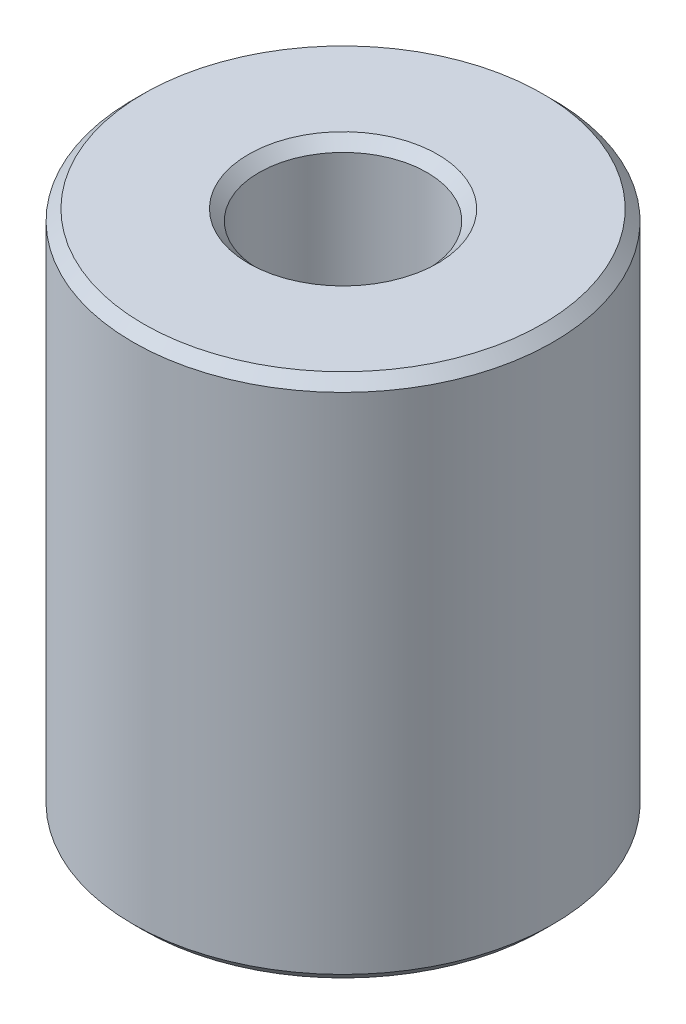
ISO-10303-21;
HEADER;
FILE_DESCRIPTION(('STEP AP214'),'2;1');
FILE_NAME('part.step','',(''),(''),'','','');
FILE_SCHEMA(('AUTOMOTIVE_DESIGN { 1 0 10303 214 1 1 1 1 }'));
ENDSEC;
DATA;
#1=APPLICATION_CONTEXT('core data for automotive mechanical design processes');
#2=APPLICATION_PROTOCOL_DEFINITION('international standard','automotive_design',2000,#1);
#3=PRODUCT_CONTEXT('',#1,'mechanical');
#4=PRODUCT('Part','Part','',(#3));
#5=PRODUCT_RELATED_PRODUCT_CATEGORY('part','',(#4));
#6=PRODUCT_DEFINITION_FORMATION('','',#4);
#7=PRODUCT_DEFINITION_CONTEXT('part definition',#1,'design');
#8=PRODUCT_DEFINITION('design','',#6,#7);
#9=PRODUCT_DEFINITION_SHAPE('','',#8);
#10=(LENGTH_UNIT() NAMED_UNIT(*) SI_UNIT(.MILLI.,.METRE.));
#11=(NAMED_UNIT(*) PLANE_ANGLE_UNIT() SI_UNIT($,.RADIAN.));
#12=(NAMED_UNIT(*) SI_UNIT($,.STERADIAN.) SOLID_ANGLE_UNIT());
#13=UNCERTAINTY_MEASURE_WITH_UNIT(LENGTH_MEASURE(1.E-05),#10,'distance_accuracy_value','');
#14=(GEOMETRIC_REPRESENTATION_CONTEXT(3) GLOBAL_UNCERTAINTY_ASSIGNED_CONTEXT((#13)) GLOBAL_UNIT_ASSIGNED_CONTEXT((#10,
#11,#12)) REPRESENTATION_CONTEXT('',''));
#15=CARTESIAN_POINT('',(0.,0.,0.));
#16=DIRECTION('',(0.,0.,1.));
#17=DIRECTION('',(1.,0.,0.));
#18=AXIS2_PLACEMENT_3D('',#15,#16,#17);
#19=CARTESIAN_POINT('',(0.,25.,0.));
#20=DIRECTION('',(0.,-1.,0.));
#21=DIRECTION('',(0.,0.,-1.));
#22=AXIS2_PLACEMENT_3D('',#19,#20,#21);
#23=CYLINDRICAL_SURFACE('',#22,10.);
#24=CARTESIAN_POINT('',(0.,0.5,0.));
#25=DIRECTION('',(0.,1.,0.));
#26=DIRECTION('',(0.,0.,1.));
#27=AXIS2_PLACEMENT_3D('',#24,#25,#26);
#28=CIRCLE('',#27,10.);
#29=CARTESIAN_POINT('',(0.,0.5,10.));
#30=VERTEX_POINT('',#29);
#31=EDGE_CURVE('E63',#30,#30,#28,.T.);
#32=ORIENTED_EDGE('',*,*,#31,.T.);
#33=EDGE_LOOP('',(#32));
#34=FACE_BOUND('',#33,.T.);
#35=CARTESIAN_POINT('',(0.,24.5,0.));
#36=DIRECTION('',(0.,1.,0.));
#37=DIRECTION('',(0.,0.,1.));
#38=AXIS2_PLACEMENT_3D('',#35,#36,#37);
#39=CIRCLE('',#38,10.);
#40=CARTESIAN_POINT('',(0.,24.5,10.));
#41=VERTEX_POINT('',#40);
#42=EDGE_CURVE('E69',#41,#41,#39,.F.);
#43=ORIENTED_EDGE('',*,*,#42,.T.);
#44=EDGE_LOOP('',(#43));
#45=FACE_BOUND('',#44,.T.);
#46=ADVANCED_FACE('F44',(#34,#45),#23,.T.);
#47=CARTESIAN_POINT('',(0.,25.,0.));
#48=DIRECTION('',(0.,1.,0.));
#49=DIRECTION('',(0.,0.,1.));
#50=AXIS2_PLACEMENT_3D('',#47,#48,#49);
#51=PLANE('',#50);
#52=CARTESIAN_POINT('',(0.,25.,0.));
#53=DIRECTION('',(0.,1.,0.));
#54=DIRECTION('',(0.,0.,1.));
#55=AXIS2_PLACEMENT_3D('',#52,#53,#54);
#56=CIRCLE('',#55,4.5);
#57=CARTESIAN_POINT('',(0.,25.,4.5));
#58=VERTEX_POINT('',#57);
#59=EDGE_CURVE('E11',#58,#58,#56,.F.);
#60=ORIENTED_EDGE('',*,*,#59,.T.);
#61=EDGE_LOOP('',(#60));
#62=FACE_BOUND('',#61,.T.);
#63=CARTESIAN_POINT('',(0.,25.,0.));
#64=DIRECTION('',(0.,1.,0.));
#65=DIRECTION('',(0.,0.,1.));
#66=AXIS2_PLACEMENT_3D('',#63,#64,#65);
#67=CIRCLE('',#66,9.50000000000001);
#68=CARTESIAN_POINT('',(0.,25.,9.50000000000001));
#69=VERTEX_POINT('',#68);
#70=EDGE_CURVE('E53',#69,#69,#67,.T.);
#71=ORIENTED_EDGE('',*,*,#70,.T.);
#72=EDGE_LOOP('',(#71));
#73=FACE_BOUND('',#72,.T.);
#74=ADVANCED_FACE('F113',(#62,#73),#51,.T.);
#75=CARTESIAN_POINT('',(0.,0.,0.));
#76=DIRECTION('',(0.,1.,0.));
#77=DIRECTION('',(0.,0.,1.));
#78=AXIS2_PLACEMENT_3D('',#75,#76,#77);
#79=PLANE('',#78);
#80=CARTESIAN_POINT('',(0.,0.,0.));
#81=DIRECTION('',(0.,1.,0.));
#82=DIRECTION('',(0.,0.,1.));
#83=AXIS2_PLACEMENT_3D('',#80,#81,#82);
#84=CIRCLE('',#83,3.00000000000001);
#85=CARTESIAN_POINT('',(0.,0.,3.00000000000001));
#86=VERTEX_POINT('',#85);
#87=EDGE_CURVE('E73',#86,#86,#84,.T.);
#88=ORIENTED_EDGE('',*,*,#87,.T.);
#89=EDGE_LOOP('',(#88));
#90=FACE_BOUND('',#89,.T.);
#91=CARTESIAN_POINT('',(0.,0.,0.));
#92=DIRECTION('',(0.,1.,0.));
#93=DIRECTION('',(0.,0.,1.));
#94=AXIS2_PLACEMENT_3D('',#91,#92,#93);
#95=CIRCLE('',#94,9.49999999999999);
#96=CARTESIAN_POINT('',(0.,0.,9.49999999999999));
#97=VERTEX_POINT('',#96);
#98=EDGE_CURVE('E77',#97,#97,#95,.F.);
#99=ORIENTED_EDGE('',*,*,#98,.T.);
#100=EDGE_LOOP('',(#99));
#101=FACE_BOUND('',#100,.T.);
#102=ADVANCED_FACE('F120',(#90,#101),#79,.F.);
#103=CARTESIAN_POINT('',(0.,15.,0.));
#104=DIRECTION('',(0.,1.,0.));
#105=DIRECTION('',(0.,0.,1.));
#106=AXIS2_PLACEMENT_3D('',#103,#104,#105);
#107=CYLINDRICAL_SURFACE('',#106,4.);
#108=CARTESIAN_POINT('',(0.,24.5,0.));
#109=DIRECTION('',(0.,1.,0.));
#110=DIRECTION('',(0.,0.,1.));
#111=AXIS2_PLACEMENT_3D('',#108,#109,#110);
#112=CIRCLE('',#111,4.);
#113=CARTESIAN_POINT('',(0.,24.5,4.));
#114=VERTEX_POINT('',#113);
#115=EDGE_CURVE('E58',#114,#114,#112,.T.);
#116=ORIENTED_EDGE('',*,*,#115,.T.);
#117=EDGE_LOOP('',(#116));
#118=FACE_BOUND('',#117,.T.);
#119=CARTESIAN_POINT('',(0.,15.,0.));
#120=DIRECTION('',(0.,1.,0.));
#121=DIRECTION('',(0.,0.,1.));
#122=AXIS2_PLACEMENT_3D('',#119,#120,#121);
#123=CIRCLE('',#122,4.);
#124=CARTESIAN_POINT('',(0.,15.,4.));
#125=VERTEX_POINT('',#124);
#126=EDGE_CURVE('E85',#125,#125,#123,.T.);
#127=ORIENTED_EDGE('',*,*,#126,.F.);
#128=EDGE_LOOP('',(#127));
#129=FACE_BOUND('',#128,.T.);
#130=ADVANCED_FACE('F109',(#118,#129),#107,.F.);
#131=CARTESIAN_POINT('',(0.,15.,0.));
#132=DIRECTION('',(0.,1.,0.));
#133=DIRECTION('',(0.,0.,1.));
#134=AXIS2_PLACEMENT_3D('',#131,#132,#133);
#135=PLANE('',#134);
#136=ORIENTED_EDGE('',*,*,#126,.T.);
#137=EDGE_LOOP('',(#136));
#138=FACE_BOUND('',#137,.T.);
#139=ADVANCED_FACE('F98',(#138),#135,.T.);
#140=CARTESIAN_POINT('',(0.,10.,0.));
#141=DIRECTION('',(0.,-1.,0.));
#142=DIRECTION('',(0.,0.,-1.));
#143=AXIS2_PLACEMENT_3D('',#140,#141,#142);
#144=CYLINDRICAL_SURFACE('',#143,2.5);
#145=CARTESIAN_POINT('',(0.,0.500000000000007,0.));
#146=DIRECTION('',(0.,1.,0.));
#147=DIRECTION('',(0.,0.,1.));
#148=AXIS2_PLACEMENT_3D('',#145,#146,#147);
#149=CIRCLE('',#148,2.5);
#150=CARTESIAN_POINT('',(0.,0.500000000000007,2.5));
#151=VERTEX_POINT('',#150);
#152=EDGE_CURVE('E81',#151,#151,#149,.F.);
#153=ORIENTED_EDGE('',*,*,#152,.T.);
#154=EDGE_LOOP('',(#153));
#155=FACE_BOUND('',#154,.T.);
#156=CARTESIAN_POINT('',(0.,10.,0.));
#157=DIRECTION('',(0.,-1.,0.));
#158=DIRECTION('',(0.,0.,-1.));
#159=AXIS2_PLACEMENT_3D('',#156,#157,#158);
#160=CIRCLE('',#159,2.5);
#161=CARTESIAN_POINT('',(0.,10.,-2.5));
#162=VERTEX_POINT('',#161);
#163=EDGE_CURVE('E89',#162,#162,#160,.T.);
#164=ORIENTED_EDGE('',*,*,#163,.F.);
#165=EDGE_LOOP('',(#164));
#166=FACE_BOUND('',#165,.T.);
#167=ADVANCED_FACE('F96',(#155,#166),#144,.F.);
#168=CARTESIAN_POINT('',(0.,10.,0.));
#169=DIRECTION('',(0.,-1.,0.));
#170=DIRECTION('',(0.,0.,-1.));
#171=AXIS2_PLACEMENT_3D('',#168,#169,#170);
#172=PLANE('',#171);
#173=ORIENTED_EDGE('',*,*,#163,.T.);
#174=EDGE_LOOP('',(#173));
#175=FACE_BOUND('',#174,.T.);
#176=ADVANCED_FACE('F94',(#175),#172,.T.);
#177=CARTESIAN_POINT('',(0.,0.500000000000007,0.));
#178=DIRECTION('',(0.,-1.,0.));
#179=DIRECTION('',(0.,0.,-1.));
#180=AXIS2_PLACEMENT_3D('',#177,#178,#179);
#181=CONICAL_SURFACE('',#180,2.5,0.78539816339745);
#182=ORIENTED_EDGE('',*,*,#87,.F.);
#183=EDGE_LOOP('',(#182));
#184=FACE_BOUND('',#183,.T.);
#185=ORIENTED_EDGE('',*,*,#152,.F.);
#186=EDGE_LOOP('',(#185));
#187=FACE_BOUND('',#186,.T.);
#188=ADVANCED_FACE('F106',(#184,#187),#181,.F.);
#189=CARTESIAN_POINT('',(0.,0.5,0.));
#190=DIRECTION('',(0.,1.,0.));
#191=DIRECTION('',(0.,0.,1.));
#192=AXIS2_PLACEMENT_3D('',#189,#190,#191);
#193=CONICAL_SURFACE('',#192,10.,0.785398163397452);
#194=ORIENTED_EDGE('',*,*,#98,.F.);
#195=EDGE_LOOP('',(#194));
#196=FACE_BOUND('',#195,.T.);
#197=ORIENTED_EDGE('',*,*,#31,.F.);
#198=EDGE_LOOP('',(#197));
#199=FACE_BOUND('',#198,.T.);
#200=ADVANCED_FACE('F131',(#196,#199),#193,.T.);
#201=CARTESIAN_POINT('',(0.,24.5,0.));
#202=DIRECTION('',(0.,1.,0.));
#203=DIRECTION('',(0.,0.,1.));
#204=AXIS2_PLACEMENT_3D('',#201,#202,#203);
#205=CONICAL_SURFACE('',#204,4.,0.785398163397459);
#206=ORIENTED_EDGE('',*,*,#59,.F.);
#207=EDGE_LOOP('',(#206));
#208=FACE_BOUND('',#207,.T.);
#209=ORIENTED_EDGE('',*,*,#115,.F.);
#210=EDGE_LOOP('',(#209));
#211=FACE_BOUND('',#210,.T.);
#212=ADVANCED_FACE('F137',(#208,#211),#205,.F.);
#213=CARTESIAN_POINT('',(0.,25.,0.));
#214=DIRECTION('',(0.,-1.,0.));
#215=DIRECTION('',(0.,0.,-1.));
#216=AXIS2_PLACEMENT_3D('',#213,#214,#215);
#217=CONICAL_SURFACE('',#216,9.50000000000001,0.785398163397441);
#218=ORIENTED_EDGE('',*,*,#42,.F.);
#219=EDGE_LOOP('',(#218));
#220=FACE_BOUND('',#219,.T.);
#221=ORIENTED_EDGE('',*,*,#70,.F.);
#222=EDGE_LOOP('',(#221));
#223=FACE_BOUND('',#222,.T.);
#224=ADVANCED_FACE('F47',(#220,#223),#217,.T.);
#225=CLOSED_SHELL('',(#46,#74,#102,#130,#139,#167,#176,#188,#200,#212,#224));
#226=MANIFOLD_SOLID_BREP('B2',#225);
#227=ADVANCED_BREP_SHAPE_REPRESENTATION('',(#18,#226),#14);
#228=SHAPE_DEFINITION_REPRESENTATION(#9,#227);
ENDSEC;
END-ISO-10303-21;
